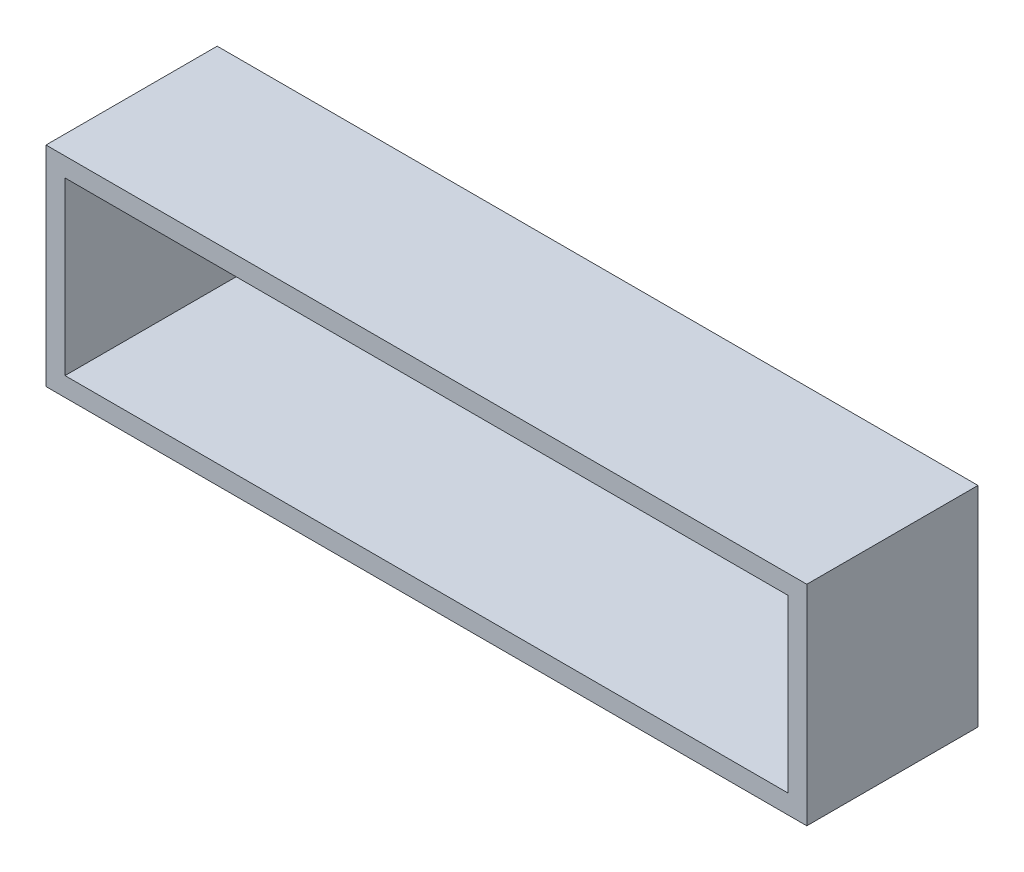
ISO-10303-21;
HEADER;
FILE_DESCRIPTION(('STEP AP214'),'2;1');
FILE_NAME('part.step','',(''),(''),'','','');
FILE_SCHEMA(('AUTOMOTIVE_DESIGN { 1 0 10303 214 1 1 1 1 }'));
ENDSEC;
DATA;
#1=APPLICATION_CONTEXT('core data for automotive mechanical design processes');
#2=APPLICATION_PROTOCOL_DEFINITION('international standard','automotive_design',2000,#1);
#3=PRODUCT_CONTEXT('',#1,'mechanical');
#4=PRODUCT('Part','Part','',(#3));
#5=PRODUCT_RELATED_PRODUCT_CATEGORY('part','',(#4));
#6=PRODUCT_DEFINITION_FORMATION('','',#4);
#7=PRODUCT_DEFINITION_CONTEXT('part definition',#1,'design');
#8=PRODUCT_DEFINITION('design','',#6,#7);
#9=PRODUCT_DEFINITION_SHAPE('','',#8);
#10=(LENGTH_UNIT() NAMED_UNIT(*) SI_UNIT(.MILLI.,.METRE.));
#11=(NAMED_UNIT(*) PLANE_ANGLE_UNIT() SI_UNIT($,.RADIAN.));
#12=(NAMED_UNIT(*) SI_UNIT($,.STERADIAN.) SOLID_ANGLE_UNIT());
#13=UNCERTAINTY_MEASURE_WITH_UNIT(LENGTH_MEASURE(1.E-05),#10,'distance_accuracy_value','');
#14=(GEOMETRIC_REPRESENTATION_CONTEXT(3) GLOBAL_UNCERTAINTY_ASSIGNED_CONTEXT((#13)) GLOBAL_UNIT_ASSIGNED_CONTEXT((#10,
#11,#12)) REPRESENTATION_CONTEXT('',''));
#15=CARTESIAN_POINT('',(0.,0.,0.));
#16=DIRECTION('',(0.,0.,1.));
#17=DIRECTION('',(1.,0.,0.));
#18=AXIS2_PLACEMENT_3D('',#15,#16,#17);
#19=CARTESIAN_POINT('',(0.,55.,0.));
#20=DIRECTION('',(1.,0.,0.));
#21=DIRECTION('',(0.,0.,-1.));
#22=AXIS2_PLACEMENT_3D('',#19,#20,#21);
#23=PLANE('',#22);
#24=DIRECTION('',(0.,0.,1.));
#25=VECTOR('',#24,1.);
#26=CARTESIAN_POINT('',(0.,0.,0.));
#27=LINE('',#26,#25);
#28=CARTESIAN_POINT('',(0.,0.,-45.));
#29=VERTEX_POINT('',#28);
#30=CARTESIAN_POINT('',(0.,0.,0.));
#31=VERTEX_POINT('',#30);
#32=EDGE_CURVE('E146',#29,#31,#27,.T.);
#33=ORIENTED_EDGE('',*,*,#32,.T.);
#34=DIRECTION('',(0.,-1.,0.));
#35=VECTOR('',#34,1.);
#36=CARTESIAN_POINT('',(0.,55.,0.));
#37=LINE('',#36,#35);
#38=CARTESIAN_POINT('',(0.,55.,0.));
#39=VERTEX_POINT('',#38);
#40=EDGE_CURVE('E11',#39,#31,#37,.T.);
#41=ORIENTED_EDGE('',*,*,#40,.F.);
#42=DIRECTION('',(0.,0.,1.));
#43=VECTOR('',#42,1.);
#44=CARTESIAN_POINT('',(0.,55.,0.));
#45=LINE('',#44,#43);
#46=CARTESIAN_POINT('',(0.,55.,-45.));
#47=VERTEX_POINT('',#46);
#48=EDGE_CURVE('E147',#47,#39,#45,.T.);
#49=ORIENTED_EDGE('',*,*,#48,.F.);
#50=DIRECTION('',(0.,-1.,0.));
#51=VECTOR('',#50,1.);
#52=CARTESIAN_POINT('',(0.,55.,-45.));
#53=LINE('',#52,#51);
#54=EDGE_CURVE('E157',#47,#29,#53,.T.);
#55=ORIENTED_EDGE('',*,*,#54,.T.);
#56=EDGE_LOOP('',(#33,#41,#49,#55));
#57=FACE_BOUND('',#56,.T.);
#58=ADVANCED_FACE('F44',(#57),#23,.F.);
#59=CARTESIAN_POINT('',(0.,55.,0.));
#60=DIRECTION('',(0.,0.,-1.));
#61=DIRECTION('',(-1.,0.,0.));
#62=AXIS2_PLACEMENT_3D('',#59,#60,#61);
#63=PLANE('',#62);
#64=DIRECTION('',(1.,0.,0.));
#65=VECTOR('',#64,1.);
#66=CARTESIAN_POINT('',(0.,50.,0.));
#67=LINE('',#66,#65);
#68=CARTESIAN_POINT('',(5.,50.,0.));
#69=VERTEX_POINT('',#68);
#70=CARTESIAN_POINT('',(195.,50.,0.));
#71=VERTEX_POINT('',#70);
#72=EDGE_CURVE('E133',#69,#71,#67,.T.);
#73=ORIENTED_EDGE('',*,*,#72,.T.);
#74=DIRECTION('',(0.,-1.,0.));
#75=VECTOR('',#74,1.);
#76=CARTESIAN_POINT('',(195.,55.,0.));
#77=LINE('',#76,#75);
#78=CARTESIAN_POINT('',(195.,5.,0.));
#79=VERTEX_POINT('',#78);
#80=EDGE_CURVE('E114',#71,#79,#77,.T.);
#81=ORIENTED_EDGE('',*,*,#80,.T.);
#82=DIRECTION('',(-1.,0.,0.));
#83=VECTOR('',#82,1.);
#84=CARTESIAN_POINT('',(0.,5.,0.));
#85=LINE('',#84,#83);
#86=CARTESIAN_POINT('',(5.,5.,0.));
#87=VERTEX_POINT('',#86);
#88=EDGE_CURVE('E142',#79,#87,#85,.T.);
#89=ORIENTED_EDGE('',*,*,#88,.T.);
#90=DIRECTION('',(0.,1.,0.));
#91=VECTOR('',#90,1.);
#92=CARTESIAN_POINT('',(5.,55.,0.));
#93=LINE('',#92,#91);
#94=EDGE_CURVE('E139',#87,#69,#93,.T.);
#95=ORIENTED_EDGE('',*,*,#94,.T.);
#96=EDGE_LOOP('',(#73,#81,#89,#95));
#97=FACE_BOUND('',#96,.T.);
#98=DIRECTION('',(1.,0.,0.));
#99=VECTOR('',#98,1.);
#100=CARTESIAN_POINT('',(0.,0.,0.));
#101=LINE('',#100,#99);
#102=CARTESIAN_POINT('',(200.,0.,0.));
#103=VERTEX_POINT('',#102);
#104=EDGE_CURVE('E160',#31,#103,#101,.T.);
#105=ORIENTED_EDGE('',*,*,#104,.T.);
#106=DIRECTION('',(0.,-1.,0.));
#107=VECTOR('',#106,1.);
#108=CARTESIAN_POINT('',(200.,55.,0.));
#109=LINE('',#108,#107);
#110=CARTESIAN_POINT('',(200.,55.,0.));
#111=VERTEX_POINT('',#110);
#112=EDGE_CURVE('E51',#111,#103,#109,.T.);
#113=ORIENTED_EDGE('',*,*,#112,.F.);
#114=DIRECTION('',(1.,0.,0.));
#115=VECTOR('',#114,1.);
#116=CARTESIAN_POINT('',(0.,55.,0.));
#117=LINE('',#116,#115);
#118=EDGE_CURVE('E150',#39,#111,#117,.T.);
#119=ORIENTED_EDGE('',*,*,#118,.F.);
#120=ORIENTED_EDGE('',*,*,#40,.T.);
#121=EDGE_LOOP('',(#105,#113,#119,#120));
#122=FACE_BOUND('',#121,.T.);
#123=ADVANCED_FACE('F188',(#97,#122),#63,.F.);
#124=CARTESIAN_POINT('',(200.,55.,0.));
#125=DIRECTION('',(-1.,0.,0.));
#126=DIRECTION('',(0.,0.,1.));
#127=AXIS2_PLACEMENT_3D('',#124,#125,#126);
#128=PLANE('',#127);
#129=DIRECTION('',(0.,0.,-1.));
#130=VECTOR('',#129,1.);
#131=CARTESIAN_POINT('',(200.,0.,0.));
#132=LINE('',#131,#130);
#133=CARTESIAN_POINT('',(200.,0.,-45.));
#134=VERTEX_POINT('',#133);
#135=EDGE_CURVE('E162',#103,#134,#132,.T.);
#136=ORIENTED_EDGE('',*,*,#135,.T.);
#137=DIRECTION('',(0.,-1.,0.));
#138=VECTOR('',#137,1.);
#139=CARTESIAN_POINT('',(200.,55.,-45.));
#140=LINE('',#139,#138);
#141=CARTESIAN_POINT('',(200.,55.,-45.));
#142=VERTEX_POINT('',#141);
#143=EDGE_CURVE('E167',#142,#134,#140,.T.);
#144=ORIENTED_EDGE('',*,*,#143,.F.);
#145=DIRECTION('',(0.,0.,-1.));
#146=VECTOR('',#145,1.);
#147=CARTESIAN_POINT('',(200.,55.,0.));
#148=LINE('',#147,#146);
#149=EDGE_CURVE('E153',#111,#142,#148,.T.);
#150=ORIENTED_EDGE('',*,*,#149,.F.);
#151=ORIENTED_EDGE('',*,*,#112,.T.);
#152=EDGE_LOOP('',(#136,#144,#150,#151));
#153=FACE_BOUND('',#152,.T.);
#154=ADVANCED_FACE('F174',(#153),#128,.F.);
#155=CARTESIAN_POINT('',(0.,55.,-45.));
#156=DIRECTION('',(0.,0.,1.));
#157=DIRECTION('',(1.,0.,0.));
#158=AXIS2_PLACEMENT_3D('',#155,#156,#157);
#159=PLANE('',#158);
#160=DIRECTION('',(1.,0.,0.));
#161=VECTOR('',#160,1.);
#162=CARTESIAN_POINT('',(5.,5.,-45.));
#163=LINE('',#162,#161);
#164=CARTESIAN_POINT('',(5.,5.,-45.));
#165=VERTEX_POINT('',#164);
#166=CARTESIAN_POINT('',(195.,5.,-45.));
#167=VERTEX_POINT('',#166);
#168=EDGE_CURVE('E117',#165,#167,#163,.T.);
#169=ORIENTED_EDGE('',*,*,#168,.T.);
#170=DIRECTION('',(0.,1.,0.));
#171=VECTOR('',#170,1.);
#172=CARTESIAN_POINT('',(195.,5.,-45.));
#173=LINE('',#172,#171);
#174=CARTESIAN_POINT('',(195.,50.,-45.));
#175=VERTEX_POINT('',#174);
#176=EDGE_CURVE('E111',#167,#175,#173,.T.);
#177=ORIENTED_EDGE('',*,*,#176,.T.);
#178=DIRECTION('',(-1.,0.,0.));
#179=VECTOR('',#178,1.);
#180=CARTESIAN_POINT('',(5.,50.,-45.));
#181=LINE('',#180,#179);
#182=CARTESIAN_POINT('',(5.,50.,-45.));
#183=VERTEX_POINT('',#182);
#184=EDGE_CURVE('E120',#175,#183,#181,.T.);
#185=ORIENTED_EDGE('',*,*,#184,.T.);
#186=DIRECTION('',(0.,-1.,0.));
#187=VECTOR('',#186,1.);
#188=CARTESIAN_POINT('',(5.,5.,-45.));
#189=LINE('',#188,#187);
#190=EDGE_CURVE('E66',#183,#165,#189,.T.);
#191=ORIENTED_EDGE('',*,*,#190,.T.);
#192=EDGE_LOOP('',(#169,#177,#185,#191));
#193=FACE_BOUND('',#192,.T.);
#194=DIRECTION('',(-1.,0.,0.));
#195=VECTOR('',#194,1.);
#196=CARTESIAN_POINT('',(0.,0.,-45.));
#197=LINE('',#196,#195);
#198=EDGE_CURVE('E151',#134,#29,#197,.T.);
#199=ORIENTED_EDGE('',*,*,#198,.T.);
#200=ORIENTED_EDGE('',*,*,#54,.F.);
#201=DIRECTION('',(-1.,0.,0.));
#202=VECTOR('',#201,1.);
#203=CARTESIAN_POINT('',(0.,55.,-45.));
#204=LINE('',#203,#202);
#205=EDGE_CURVE('E155',#142,#47,#204,.T.);
#206=ORIENTED_EDGE('',*,*,#205,.F.);
#207=ORIENTED_EDGE('',*,*,#143,.T.);
#208=EDGE_LOOP('',(#199,#200,#206,#207));
#209=FACE_BOUND('',#208,.T.);
#210=ADVANCED_FACE('F124',(#193,#209),#159,.F.);
#211=CARTESIAN_POINT('',(0.,55.,0.));
#212=DIRECTION('',(0.,-1.,0.));
#213=DIRECTION('',(0.,0.,-1.));
#214=AXIS2_PLACEMENT_3D('',#211,#212,#213);
#215=PLANE('',#214);
#216=ORIENTED_EDGE('',*,*,#48,.T.);
#217=ORIENTED_EDGE('',*,*,#118,.T.);
#218=ORIENTED_EDGE('',*,*,#149,.T.);
#219=ORIENTED_EDGE('',*,*,#205,.T.);
#220=EDGE_LOOP('',(#216,#217,#218,#219));
#221=FACE_BOUND('',#220,.T.);
#222=ADVANCED_FACE('F187',(#221),#215,.F.);
#223=CARTESIAN_POINT('',(0.,0.,0.));
#224=DIRECTION('',(0.,-1.,0.));
#225=DIRECTION('',(0.,0.,-1.));
#226=AXIS2_PLACEMENT_3D('',#223,#224,#225);
#227=PLANE('',#226);
#228=ORIENTED_EDGE('',*,*,#32,.F.);
#229=ORIENTED_EDGE('',*,*,#198,.F.);
#230=ORIENTED_EDGE('',*,*,#135,.F.);
#231=ORIENTED_EDGE('',*,*,#104,.F.);
#232=EDGE_LOOP('',(#228,#229,#230,#231));
#233=FACE_BOUND('',#232,.T.);
#234=ADVANCED_FACE('F180',(#233),#227,.T.);
#235=CARTESIAN_POINT('',(195.,5.,-45.));
#236=DIRECTION('',(1.,0.,0.));
#237=DIRECTION('',(0.,0.,-1.));
#238=AXIS2_PLACEMENT_3D('',#235,#236,#237);
#239=PLANE('',#238);
#240=DIRECTION('',(0.,0.,1.));
#241=VECTOR('',#240,1.);
#242=CARTESIAN_POINT('',(195.,50.,-45.));
#243=LINE('',#242,#241);
#244=EDGE_CURVE('E58',#175,#71,#243,.T.);
#245=ORIENTED_EDGE('',*,*,#244,.F.);
#246=ORIENTED_EDGE('',*,*,#176,.F.);
#247=DIRECTION('',(0.,0.,1.));
#248=VECTOR('',#247,1.);
#249=CARTESIAN_POINT('',(195.,5.,-45.));
#250=LINE('',#249,#248);
#251=EDGE_CURVE('E131',#167,#79,#250,.T.);
#252=ORIENTED_EDGE('',*,*,#251,.T.);
#253=ORIENTED_EDGE('',*,*,#80,.F.);
#254=EDGE_LOOP('',(#245,#246,#252,#253));
#255=FACE_BOUND('',#254,.T.);
#256=ADVANCED_FACE('F108',(#255),#239,.F.);
#257=CARTESIAN_POINT('',(5.,5.,-45.));
#258=DIRECTION('',(0.,-1.,0.));
#259=DIRECTION('',(0.,0.,-1.));
#260=AXIS2_PLACEMENT_3D('',#257,#258,#259);
#261=PLANE('',#260);
#262=ORIENTED_EDGE('',*,*,#251,.F.);
#263=ORIENTED_EDGE('',*,*,#168,.F.);
#264=DIRECTION('',(0.,0.,1.));
#265=VECTOR('',#264,1.);
#266=CARTESIAN_POINT('',(5.,5.,-45.));
#267=LINE('',#266,#265);
#268=EDGE_CURVE('E134',#165,#87,#267,.T.);
#269=ORIENTED_EDGE('',*,*,#268,.T.);
#270=ORIENTED_EDGE('',*,*,#88,.F.);
#271=EDGE_LOOP('',(#262,#263,#269,#270));
#272=FACE_BOUND('',#271,.T.);
#273=ADVANCED_FACE('F205',(#272),#261,.F.);
#274=CARTESIAN_POINT('',(5.,5.,-45.));
#275=DIRECTION('',(-1.,0.,0.));
#276=DIRECTION('',(0.,0.,1.));
#277=AXIS2_PLACEMENT_3D('',#274,#275,#276);
#278=PLANE('',#277);
#279=ORIENTED_EDGE('',*,*,#268,.F.);
#280=ORIENTED_EDGE('',*,*,#190,.F.);
#281=DIRECTION('',(0.,0.,1.));
#282=VECTOR('',#281,1.);
#283=CARTESIAN_POINT('',(5.,50.,-45.));
#284=LINE('',#283,#282);
#285=EDGE_CURVE('E116',#183,#69,#284,.T.);
#286=ORIENTED_EDGE('',*,*,#285,.T.);
#287=ORIENTED_EDGE('',*,*,#94,.F.);
#288=EDGE_LOOP('',(#279,#280,#286,#287));
#289=FACE_BOUND('',#288,.T.);
#290=ADVANCED_FACE('F208',(#289),#278,.F.);
#291=CARTESIAN_POINT('',(5.,50.,-45.));
#292=DIRECTION('',(0.,1.,0.));
#293=DIRECTION('',(0.,0.,1.));
#294=AXIS2_PLACEMENT_3D('',#291,#292,#293);
#295=PLANE('',#294);
#296=ORIENTED_EDGE('',*,*,#285,.F.);
#297=ORIENTED_EDGE('',*,*,#184,.F.);
#298=ORIENTED_EDGE('',*,*,#244,.T.);
#299=ORIENTED_EDGE('',*,*,#72,.F.);
#300=EDGE_LOOP('',(#296,#297,#298,#299));
#301=FACE_BOUND('',#300,.T.);
#302=ADVANCED_FACE('F121',(#301),#295,.F.);
#303=CLOSED_SHELL('',(#58,#123,#154,#210,#222,#234,#256,#273,#290,#302));
#304=MANIFOLD_SOLID_BREP('B2',#303);
#305=ADVANCED_BREP_SHAPE_REPRESENTATION('',(#18,#304),#14);
#306=SHAPE_DEFINITION_REPRESENTATION(#9,#305);
ENDSEC;
END-ISO-10303-21;
